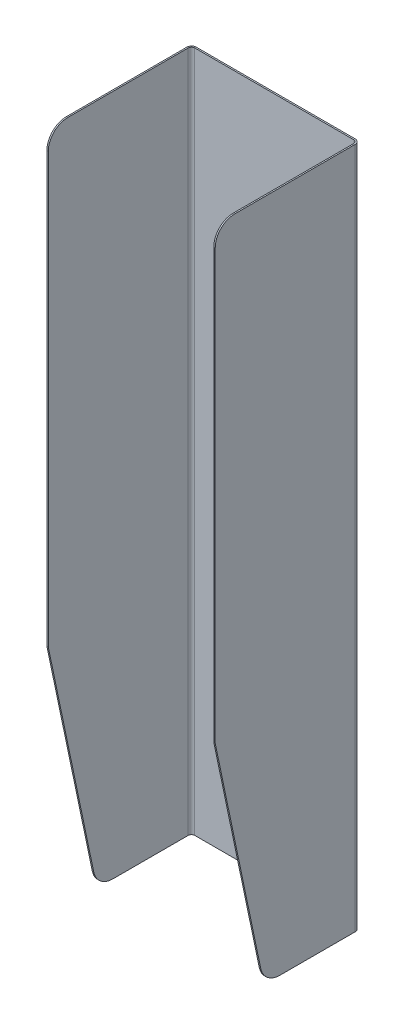
ISO-10303-21;
HEADER;
FILE_DESCRIPTION(('STEP AP214'),'2;1');
FILE_NAME('part.step','',(''),(''),'','','');
FILE_SCHEMA(('AUTOMOTIVE_DESIGN { 1 0 10303 214 1 1 1 1 }'));
ENDSEC;
DATA;
#1=APPLICATION_CONTEXT('core data for automotive mechanical design processes');
#2=APPLICATION_PROTOCOL_DEFINITION('international standard','automotive_design',2000,#1);
#3=PRODUCT_CONTEXT('',#1,'mechanical');
#4=PRODUCT('Part','Part','',(#3));
#5=PRODUCT_RELATED_PRODUCT_CATEGORY('part','',(#4));
#6=PRODUCT_DEFINITION_FORMATION('','',#4);
#7=PRODUCT_DEFINITION_CONTEXT('part definition',#1,'design');
#8=PRODUCT_DEFINITION('design','',#6,#7);
#9=PRODUCT_DEFINITION_SHAPE('','',#8);
#10=(LENGTH_UNIT() NAMED_UNIT(*) SI_UNIT(.MILLI.,.METRE.));
#11=(NAMED_UNIT(*) PLANE_ANGLE_UNIT() SI_UNIT($,.RADIAN.));
#12=(NAMED_UNIT(*) SI_UNIT($,.STERADIAN.) SOLID_ANGLE_UNIT());
#13=UNCERTAINTY_MEASURE_WITH_UNIT(LENGTH_MEASURE(1.E-05),#10,'distance_accuracy_value','');
#14=(GEOMETRIC_REPRESENTATION_CONTEXT(3) GLOBAL_UNCERTAINTY_ASSIGNED_CONTEXT((#13)) GLOBAL_UNIT_ASSIGNED_CONTEXT((#10,
#11,#12)) REPRESENTATION_CONTEXT('',''));
#15=CARTESIAN_POINT('',(0.,0.,0.));
#16=DIRECTION('',(0.,0.,1.));
#17=DIRECTION('',(1.,0.,0.));
#18=AXIS2_PLACEMENT_3D('',#15,#16,#17);
#19=CARTESIAN_POINT('',(5710.61630451223,-816.447312940981,3424.54131291176));
#20=DIRECTION('',(0.,-0.204525333933384,0.978861270956941));
#21=DIRECTION('',(0.,-0.978861270956941,-0.204525333933384));
#22=AXIS2_PLACEMENT_3D('',#19,#20,#21);
#23=PLANE('',#22);
#24=DIRECTION('',(1.,0.,0.));
#25=VECTOR('',#24,1.);
#26=CARTESIAN_POINT('',(6243.83674885551,-564.899532154496,3477.10023560305));
#27=LINE('',#26,#25);
#28=CARTESIAN_POINT('',(6243.12024088786,-564.899532154487,3477.10023560292));
#29=VERTEX_POINT('',#28);
#30=CARTESIAN_POINT('',(6244.55325682317,-564.899532155283,3477.10023560276));
#31=VERTEX_POINT('',#30);
#32=EDGE_CURVE('E246',#29,#31,#27,.T.);
#33=ORIENTED_EDGE('',*,*,#32,.F.);
#34=DIRECTION('',(0.,0.978861270956941,0.204525333933385));
#35=VECTOR('',#34,1.);
#36=CARTESIAN_POINT('',(6243.12024088786,-788.3203147037,3430.41822711575));
#37=LINE('',#36,#35);
#38=CARTESIAN_POINT('',(6243.12024088786,-788.320314703688,3430.41822711575));
#39=VERTEX_POINT('',#38);
#40=EDGE_CURVE('E213',#39,#29,#37,.T.);
#41=ORIENTED_EDGE('',*,*,#40,.F.);
#42=DIRECTION('',(-1.,0.,0.));
#43=VECTOR('',#42,1.);
#44=CARTESIAN_POINT('',(6243.83674885551,-788.3203147037,3430.41822711575));
#45=LINE('',#44,#43);
#46=CARTESIAN_POINT('',(6244.55325682317,-788.320314703688,3430.41822711575));
#47=VERTEX_POINT('',#46);
#48=EDGE_CURVE('E241',#47,#39,#45,.T.);
#49=ORIENTED_EDGE('',*,*,#48,.F.);
#50=DIRECTION('',(0.,-0.978861270956938,-0.204525333933397));
#51=VECTOR('',#50,1.);
#52=CARTESIAN_POINT('',(6244.55325682317,-564.899532154508,3477.10023560288));
#53=LINE('',#52,#51);
#54=EDGE_CURVE('E230',#31,#47,#53,.T.);
#55=ORIENTED_EDGE('',*,*,#54,.F.);
#56=EDGE_LOOP('',(#33,#41,#49,#55));
#57=FACE_BOUND('',#56,.T.);
#58=ADVANCED_FACE('F17',(#57),#23,.T.);
#59=CARTESIAN_POINT('',(6243.12024088786,-804.229808025032,3477.10023560305));
#60=DIRECTION('',(0.,0.,1.));
#61=DIRECTION('',(1.,0.,0.));
#62=AXIS2_PLACEMENT_3D('',#59,#60,#61);
#63=PLANE('',#62);
#64=DIRECTION('',(1.,1.65841347602452E-12,-1.18150694116774E-11));
#65=VECTOR('',#64,1.);
#66=CARTESIAN_POINT('',(6236.09080639473,-124.229808025051,3477.10023560189));
#67=LINE('',#66,#65);
#68=CARTESIAN_POINT('',(6243.12024088813,-124.229808020915,3477.10023560234));
#69=VERTEX_POINT('',#68);
#70=CARTESIAN_POINT('',(6244.55325682317,-124.229808020912,3477.10023560217));
#71=VERTEX_POINT('',#70);
#72=EDGE_CURVE('E152',#69,#71,#67,.T.);
#73=ORIENTED_EDGE('',*,*,#72,.F.);
#74=DIRECTION('',(0.,1.,0.));
#75=VECTOR('',#74,1.);
#76=CARTESIAN_POINT('',(6243.12024088786,-454.229808025032,3477.10023560288));
#77=LINE('',#76,#75);
#78=EDGE_CURVE('E210',#29,#69,#77,.T.);
#79=ORIENTED_EDGE('',*,*,#78,.F.);
#80=ORIENTED_EDGE('',*,*,#32,.T.);
#81=DIRECTION('',(0.,-1.,0.));
#82=VECTOR('',#81,1.);
#83=CARTESIAN_POINT('',(6244.55325682317,-454.229808025032,3477.10023560255));
#84=LINE('',#83,#82);
#85=EDGE_CURVE('E160',#71,#31,#84,.T.);
#86=ORIENTED_EDGE('',*,*,#85,.F.);
#87=EDGE_LOOP('',(#73,#79,#80,#86));
#88=FACE_BOUND('',#87,.T.);
#89=ADVANCED_FACE('F375',(#88),#63,.T.);
#90=CARTESIAN_POINT('',(6099.82030520555,-124.229808017028,3457.10023561151));
#91=DIRECTION('',(1.,1.65841347602452E-12,-1.18150694116774E-11));
#92=DIRECTION('',(-1.18150694116774E-11,0.,-1.));
#93=AXIS2_PLACEMENT_3D('',#90,#91,#92);
#94=CYLINDRICAL_SURFACE('',#93,19.9999999918697);
#95=DIRECTION('',(-1.,0.,2.79595608917691E-11));
#96=VECTOR('',#95,1.);
#97=CARTESIAN_POINT('',(6236.09080639237,-104.229808025032,3457.1002356079));
#98=LINE('',#97,#96);
#99=CARTESIAN_POINT('',(6244.55325682284,-104.229808025032,3457.10023560873));
#100=VERTEX_POINT('',#99);
#101=CARTESIAN_POINT('',(6243.12024088786,-104.229808025032,3457.10023560876));
#102=VERTEX_POINT('',#101);
#103=EDGE_CURVE('E139',#100,#102,#98,.T.);
#104=ORIENTED_EDGE('',*,*,#103,.T.);
#105=CARTESIAN_POINT('',(6243.12024088789,-124.22980801679,3457.10023560982));
#106=DIRECTION('',(1.,1.65841347602452E-12,-1.18150694116774E-11));
#107=DIRECTION('',(-1.18150694116774E-11,0.,-1.));
#108=AXIS2_PLACEMENT_3D('',#105,#106,#107);
#109=CIRCLE('',#108,19.9999999918697);
#110=EDGE_CURVE('E212',#69,#102,#109,.F.);
#111=ORIENTED_EDGE('',*,*,#110,.F.);
#112=ORIENTED_EDGE('',*,*,#72,.T.);
#113=CARTESIAN_POINT('',(6244.55325682293,-124.229808016788,3457.1002356098));
#114=DIRECTION('',(1.,1.65841347602452E-12,-1.18150694116774E-11));
#115=DIRECTION('',(-1.18150694116774E-11,0.,-1.));
#116=AXIS2_PLACEMENT_3D('',#113,#114,#115);
#117=CIRCLE('',#116,19.9999999918697);
#118=EDGE_CURVE('E21',#100,#71,#117,.T.);
#119=ORIENTED_EDGE('',*,*,#118,.F.);
#120=EDGE_LOOP('',(#104,#111,#112,#119));
#121=FACE_BOUND('',#120,.T.);
#122=ADVANCED_FACE('F156',(#121),#94,.T.);
#123=CARTESIAN_POINT('',(5855.82311737198,-784.229808025028,3410.84100169661));
#124=DIRECTION('',(1.,0.,0.));
#125=DIRECTION('',(0.,1.,0.));
#126=AXIS2_PLACEMENT_3D('',#123,#124,#125);
#127=CYLINDRICAL_SURFACE('',#126,20.0000000000027);
#128=ORIENTED_EDGE('',*,*,#48,.T.);
#129=CARTESIAN_POINT('',(6243.12024088786,-784.229808025002,3410.84100169659));
#130=DIRECTION('',(1.,0.,0.));
#131=DIRECTION('',(0.,1.,0.));
#132=AXIS2_PLACEMENT_3D('',#129,#130,#131);
#133=CIRCLE('',#132,20.0000000000027);
#134=CARTESIAN_POINT('',(6243.12024088786,-804.229808025032,3410.8410016966));
#135=VERTEX_POINT('',#134);
#136=EDGE_CURVE('E328',#135,#39,#133,.F.);
#137=ORIENTED_EDGE('',*,*,#136,.F.);
#138=DIRECTION('',(1.,0.,0.));
#139=VECTOR('',#138,1.);
#140=CARTESIAN_POINT('',(6243.83674885551,-804.229808025032,3410.84100169661));
#141=LINE('',#140,#139);
#142=CARTESIAN_POINT('',(6244.55325682317,-804.229808025032,3410.8410016966));
#143=VERTEX_POINT('',#142);
#144=EDGE_CURVE('E151',#135,#143,#141,.T.);
#145=ORIENTED_EDGE('',*,*,#144,.T.);
#146=CARTESIAN_POINT('',(6244.55325682317,-784.229808025002,3410.84100169659));
#147=DIRECTION('',(1.,0.,0.));
#148=DIRECTION('',(0.,1.,0.));
#149=AXIS2_PLACEMENT_3D('',#146,#147,#148);
#150=CIRCLE('',#149,20.0000000000027);
#151=EDGE_CURVE('E228',#47,#143,#150,.T.);
#152=ORIENTED_EDGE('',*,*,#151,.F.);
#153=EDGE_LOOP('',(#128,#137,#145,#152));
#154=FACE_BOUND('',#153,.T.);
#155=ADVANCED_FACE('F347',(#154),#127,.T.);
#156=CARTESIAN_POINT('',(6271.20901105684,-124.229808017864,3457.10023561167));
#157=DIRECTION('',(1.,0.,-2.93728386884162E-11));
#158=DIRECTION('',(-2.93728386884162E-11,0.,-1.));
#159=AXIS2_PLACEMENT_3D('',#156,#157,#158);
#160=CYLINDRICAL_SURFACE('',#159,19.9999999927421);
#161=DIRECTION('',(-1.,0.,2.3156299631593E-11));
#162=VECTOR('',#161,1.);
#163=CARTESIAN_POINT('',(6415.22545472493,-104.229808025032,3457.10023560811));
#164=LINE('',#163,#162);
#165=CARTESIAN_POINT('',(6415.94196268623,-104.229808025032,3457.10023560776));
#166=VERTEX_POINT('',#165);
#167=CARTESIAN_POINT('',(6414.50894675156,-104.229808025032,3457.1002356078));
#168=VERTEX_POINT('',#167);
#169=EDGE_CURVE('E239',#166,#168,#164,.T.);
#170=ORIENTED_EDGE('',*,*,#169,.T.);
#171=CARTESIAN_POINT('',(6414.50894675156,-124.22980801785,3457.10023560746));
#172=DIRECTION('',(1.,0.,-2.93728386884162E-11));
#173=DIRECTION('',(-2.93728386884162E-11,0.,-1.));
#174=AXIS2_PLACEMENT_3D('',#171,#172,#173);
#175=CIRCLE('',#174,19.9999999927421);
#176=CARTESIAN_POINT('',(6414.50894675186,-124.229808021379,3477.10023560276));
#177=VERTEX_POINT('',#176);
#178=EDGE_CURVE('E218',#177,#168,#175,.F.);
#179=ORIENTED_EDGE('',*,*,#178,.F.);
#180=DIRECTION('',(-1.,0.,0.));
#181=VECTOR('',#180,1.);
#182=CARTESIAN_POINT('',(6415.22545471922,-124.229808024907,3477.10023560305));
#183=LINE('',#182,#181);
#184=CARTESIAN_POINT('',(6415.94196268687,-124.229808021379,3477.10023560249));
#185=VERTEX_POINT('',#184);
#186=EDGE_CURVE('E237',#185,#177,#183,.T.);
#187=ORIENTED_EDGE('',*,*,#186,.F.);
#188=CARTESIAN_POINT('',(6415.94196268628,-124.22980801785,3457.10023560742));
#189=DIRECTION('',(1.,0.,-2.93728386884162E-11));
#190=DIRECTION('',(-2.93728386884162E-11,0.,-1.));
#191=AXIS2_PLACEMENT_3D('',#188,#189,#190);
#192=CIRCLE('',#191,19.9999999927421);
#193=EDGE_CURVE('E207',#166,#185,#192,.T.);
#194=ORIENTED_EDGE('',*,*,#193,.F.);
#195=EDGE_LOOP('',(#170,#179,#187,#194));
#196=FACE_BOUND('',#195,.T.);
#197=ADVANCED_FACE('F409',(#196),#160,.T.);
#198=CARTESIAN_POINT('',(6414.50894675156,-804.229808025032,3477.10023560305));
#199=DIRECTION('',(0.,0.,1.));
#200=DIRECTION('',(1.,0.,0.));
#201=AXIS2_PLACEMENT_3D('',#198,#199,#200);
#202=PLANE('',#201);
#203=ORIENTED_EDGE('',*,*,#186,.T.);
#204=DIRECTION('',(0.,1.,0.));
#205=VECTOR('',#204,1.);
#206=CARTESIAN_POINT('',(6414.50894675156,-454.229808025032,3477.10023560267));
#207=LINE('',#206,#205);
#208=CARTESIAN_POINT('',(6414.50894675156,-564.899532155527,3477.10023560267));
#209=VERTEX_POINT('',#208);
#210=EDGE_CURVE('E215',#209,#177,#207,.T.);
#211=ORIENTED_EDGE('',*,*,#210,.F.);
#212=DIRECTION('',(1.,0.,0.));
#213=VECTOR('',#212,1.);
#214=CARTESIAN_POINT('',(5710.61630451223,-564.89953215554,3477.10023560266));
#215=LINE('',#214,#213);
#216=CARTESIAN_POINT('',(6415.94196268687,-564.899532157289,3477.1002356023));
#217=VERTEX_POINT('',#216);
#218=EDGE_CURVE('E233',#217,#209,#215,.F.);
#219=ORIENTED_EDGE('',*,*,#218,.F.);
#220=DIRECTION('',(0.,-1.,0.));
#221=VECTOR('',#220,1.);
#222=CARTESIAN_POINT('',(6415.94196268687,-454.229808025032,3477.10023560193));
#223=LINE('',#222,#221);
#224=EDGE_CURVE('E203',#185,#217,#223,.T.);
#225=ORIENTED_EDGE('',*,*,#224,.F.);
#226=EDGE_LOOP('',(#203,#211,#219,#225));
#227=FACE_BOUND('',#226,.T.);
#228=ADVANCED_FACE('F406',(#227),#202,.T.);
#229=CARTESIAN_POINT('',(5710.61630451223,-816.447312940981,3424.54131291176));
#230=DIRECTION('',(0.,-0.204525333933384,0.978861270956941));
#231=DIRECTION('',(0.,-0.978861270956941,-0.204525333933384));
#232=AXIS2_PLACEMENT_3D('',#229,#230,#231);
#233=PLANE('',#232);
#234=ORIENTED_EDGE('',*,*,#218,.T.);
#235=DIRECTION('',(0.,0.978861270956938,0.204525333933397));
#236=VECTOR('',#235,1.);
#237=CARTESIAN_POINT('',(6414.50894675156,-788.3203147037,3430.41822711575));
#238=LINE('',#237,#236);
#239=CARTESIAN_POINT('',(6414.50894675156,-788.320314703688,3430.41822711575));
#240=VERTEX_POINT('',#239);
#241=EDGE_CURVE('E219',#240,#209,#238,.T.);
#242=ORIENTED_EDGE('',*,*,#241,.F.);
#243=DIRECTION('',(-1.,0.,0.));
#244=VECTOR('',#243,1.);
#245=CARTESIAN_POINT('',(6415.22545471922,-788.3203147037,3430.41822711575));
#246=LINE('',#245,#244);
#247=CARTESIAN_POINT('',(6415.94196268687,-788.320314703688,3430.41822711575));
#248=VERTEX_POINT('',#247);
#249=EDGE_CURVE('E161',#248,#240,#246,.T.);
#250=ORIENTED_EDGE('',*,*,#249,.F.);
#251=DIRECTION('',(0.,-0.978861270956942,-0.204525333933378));
#252=VECTOR('',#251,1.);
#253=CARTESIAN_POINT('',(6415.94196268687,-564.89953215554,3477.10023560266));
#254=LINE('',#253,#252);
#255=EDGE_CURVE('E206',#217,#248,#254,.T.);
#256=ORIENTED_EDGE('',*,*,#255,.F.);
#257=EDGE_LOOP('',(#234,#242,#250,#256));
#258=FACE_BOUND('',#257,.T.);
#259=ADVANCED_FACE('F402',(#258),#233,.T.);
#260=CARTESIAN_POINT('',(6027.21182323569,-784.229808025028,3410.84100169661));
#261=DIRECTION('',(1.,0.,0.));
#262=DIRECTION('',(0.,1.,0.));
#263=AXIS2_PLACEMENT_3D('',#260,#261,#262);
#264=CYLINDRICAL_SURFACE('',#263,20.0000000000027);
#265=ORIENTED_EDGE('',*,*,#249,.T.);
#266=CARTESIAN_POINT('',(6414.50894675156,-784.229808025002,3410.84100169659));
#267=DIRECTION('',(1.,0.,0.));
#268=DIRECTION('',(0.,1.,0.));
#269=AXIS2_PLACEMENT_3D('',#266,#267,#268);
#270=CIRCLE('',#269,20.0000000000027);
#271=CARTESIAN_POINT('',(6414.50894675156,-804.229808025032,3410.8410016966));
#272=VERTEX_POINT('',#271);
#273=EDGE_CURVE('E222',#272,#240,#270,.F.);
#274=ORIENTED_EDGE('',*,*,#273,.F.);
#275=DIRECTION('',(1.,0.,0.));
#276=VECTOR('',#275,1.);
#277=CARTESIAN_POINT('',(6415.22545471922,-804.229808025032,3410.84100169661));
#278=LINE('',#277,#276);
#279=CARTESIAN_POINT('',(6415.94196268687,-804.229808025032,3410.8410016966));
#280=VERTEX_POINT('',#279);
#281=EDGE_CURVE('E231',#272,#280,#278,.T.);
#282=ORIENTED_EDGE('',*,*,#281,.T.);
#283=CARTESIAN_POINT('',(6415.94196268687,-784.229808025002,3410.84100169659));
#284=DIRECTION('',(1.,0.,0.));
#285=DIRECTION('',(0.,1.,0.));
#286=AXIS2_PLACEMENT_3D('',#283,#284,#285);
#287=CIRCLE('',#286,20.0000000000027);
#288=EDGE_CURVE('E202',#248,#280,#287,.T.);
#289=ORIENTED_EDGE('',*,*,#288,.F.);
#290=EDGE_LOOP('',(#265,#274,#282,#289));
#291=FACE_BOUND('',#290,.T.);
#292=ADVANCED_FACE('F399',(#291),#264,.T.);
#293=CARTESIAN_POINT('',(6244.55325682317,-804.229808025032,3477.24373560305));
#294=DIRECTION('',(1.,0.,0.));
#295=DIRECTION('',(0.,0.,-1.));
#296=AXIS2_PLACEMENT_3D('',#293,#294,#295);
#297=PLANE('',#296);
#298=ORIENTED_EDGE('',*,*,#54,.T.);
#299=ORIENTED_EDGE('',*,*,#151,.T.);
#300=DIRECTION('',(0.,0.,-1.));
#301=VECTOR('',#300,1.);
#302=CARTESIAN_POINT('',(6244.55325682317,-804.229808025032,3310.03773560305));
#303=LINE('',#302,#301);
#304=CARTESIAN_POINT('',(6244.55325682317,-804.229808025032,3333.60023560305));
#305=VERTEX_POINT('',#304);
#306=EDGE_CURVE('E186',#305,#143,#303,.F.);
#307=ORIENTED_EDGE('',*,*,#306,.F.);
#308=DIRECTION('',(0.,-1.,0.));
#309=VECTOR('',#308,1.);
#310=CARTESIAN_POINT('',(6244.55325682317,-454.229808025032,3333.60023560305));
#311=LINE('',#310,#309);
#312=CARTESIAN_POINT('',(6244.55325682307,-104.229808025032,3333.60023560305));
#313=VERTEX_POINT('',#312);
#314=EDGE_CURVE('E165',#313,#305,#311,.T.);
#315=ORIENTED_EDGE('',*,*,#314,.F.);
#316=DIRECTION('',(0.,0.,1.));
#317=VECTOR('',#316,1.);
#318=CARTESIAN_POINT('',(6244.55325682277,-104.229808025032,3310.03773560305));
#319=LINE('',#318,#317);
#320=EDGE_CURVE('E145',#100,#313,#319,.F.);
#321=ORIENTED_EDGE('',*,*,#320,.F.);
#322=ORIENTED_EDGE('',*,*,#118,.T.);
#323=ORIENTED_EDGE('',*,*,#85,.T.);
#324=EDGE_LOOP('',(#298,#299,#307,#315,#321,#322,#323));
#325=FACE_BOUND('',#324,.T.);
#326=ADVANCED_FACE('F163',(#325),#297,.T.);
#327=CARTESIAN_POINT('',(6244.55325682317,-804.229808025032,3333.60023560305));
#328=CARTESIAN_POINT('',(6244.55325682317,-104.229808025032,3333.60023560305));
#329=CARTESIAN_POINT('',(6244.55325682317,-804.229808025032,3330.10023560305));
#330=CARTESIAN_POINT('',(6244.55325682317,-104.229808025032,3330.10023560305));
#331=CARTESIAN_POINT('',(6247.89696067224,-804.229808025032,3330.10023560305));
#332=CARTESIAN_POINT('',(6247.89696067224,-104.229808025032,3330.10023560305));
#333=(BOUNDED_SURFACE() B_SPLINE_SURFACE(2,1,((#327,#328),(#329,#330),(#331,#332)),
.UNSPECIFIED.,.F.,.F.,.F.) B_SPLINE_SURFACE_WITH_KNOTS((3,3),(2,2),(622.071814493869,
629.877862906506),(0.,700.),
.UNSPECIFIED.) GEOMETRIC_REPRESENTATION_ITEM() RATIONAL_B_SPLINE_SURFACE(((1.,1.),
(0.707106781185812,0.707106781185812),(1.,1.))) REPRESENTATION_ITEM('') SURFACE());
#334=CARTESIAN_POINT('',(6244.55325682317,-104.229808025032,3333.60023560305));
#335=CARTESIAN_POINT('',(6244.55325033344,-104.229808025032,3333.498273813));
#336=CARTESIAN_POINT('',(6244.55751350092,-104.229808025032,3333.39631507893));
#337=CARTESIAN_POINT('',(6244.57452822644,-104.229808025032,3333.19310385464));
#338=CARTESIAN_POINT('',(6244.58728016508,-104.229808025032,3333.0918513963));
#339=CARTESIAN_POINT('',(6244.62123229109,-104.229808025032,3332.89069819503));
#340=CARTESIAN_POINT('',(6244.64243784502,-104.229808025032,3332.79079835252));
#341=CARTESIAN_POINT('',(6244.69316746271,-104.229808025032,3332.59316562431));
#342=CARTESIAN_POINT('',(6244.7226912768,-104.229808025032,3332.49543267367));
#343=CARTESIAN_POINT('',(6244.82361523519,-104.229808025032,3332.20635271503));
#344=CARTESIAN_POINT('',(6244.90736541514,-104.229808025032,3332.01913931161));
#345=CARTESIAN_POINT('',(6245.10574970815,-104.229808025032,3331.66207822541));
#346=CARTESIAN_POINT('',(6245.22036606828,-104.229808025032,3331.49222063751));
#347=CARTESIAN_POINT('',(6245.47472792363,-104.229808025032,3331.1789343234));
#348=CARTESIAN_POINT('',(6245.61382806362,-104.229808025032,3331.03498346482));
#349=CARTESIAN_POINT('',(6245.91521549723,-104.229808025032,3330.77376946968));
#350=CARTESIAN_POINT('',(6246.07750430018,-104.229808025032,3330.6565080716));
#351=CARTESIAN_POINT('',(6246.41312903326,-104.229808025032,3330.45754930641));
#352=CARTESIAN_POINT('',(6246.58566718463,-104.229808025032,3330.37451662047));
#353=CARTESIAN_POINT('',(6246.85309279605,-104.229808025032,3330.27368050835));
#354=CARTESIAN_POINT('',(6246.9436659454,-104.229808025032,3330.24402158429));
#355=CARTESIAN_POINT('',(6247.12707096168,-104.229808025032,3330.19282995535));
#356=CARTESIAN_POINT('',(6247.21990196585,-104.229808025032,3330.17129419683));
#357=CARTESIAN_POINT('',(6247.40972887243,-104.229808025032,3330.13608298919));
#358=CARTESIAN_POINT('',(6247.50676863254,-104.229808025032,3330.12264433662));
#359=CARTESIAN_POINT('',(6247.70152471279,-104.229808025032,3330.10471937184));
#360=CARTESIAN_POINT('',(6247.79923980763,-104.229808025032,3330.10021973389));
#361=CARTESIAN_POINT('',(6247.89696067224,-104.229808025032,3330.10023560305));
#362=B_SPLINE_CURVE_WITH_KNOTS('',3,(#334,#335,#336,#337,#338,#339,#340,#341,#342,#343,#344,
#345,#346,#347,#348,#349,#350,#351,#352,#353,#354,#355,#356,#357,#358,#359,#360,#361),
.UNSPECIFIED.,.F.,.F.,(4,2,2,2,2,2,2,2,2,2,2,2,2,4),(0.,0.30579035948938,0.611594429708169,
0.917592941690297,1.22358227031815,1.83560511797808,2.44727670462998,3.04474408803706,
3.64225037809817,4.21352507286864,4.49913160700031,4.78463066938612,5.07811815852732,
5.37116780490268),.UNSPECIFIED.);
#363=CARTESIAN_POINT('',(6247.89696067224,-104.229808025032,3330.10023560305));
#364=VERTEX_POINT('',#363);
#365=EDGE_CURVE('E167',#313,#364,#362,.T.);
#366=CARTESIAN_POINT('',(6247.89696067224,-804.229808025032,3330.10023560305));
#367=CARTESIAN_POINT('',(6247.80604736971,-804.229808025032,3330.10022401638));
#368=CARTESIAN_POINT('',(6247.71513963073,-804.229808025032,3330.10411656748));
#369=CARTESIAN_POINT('',(6247.53399695496,-804.229808025032,3330.11962079665));
#370=CARTESIAN_POINT('',(6247.44376192722,-804.229808025032,3330.13123141142));
#371=CARTESIAN_POINT('',(6247.26477764718,-804.229808025032,3330.16205223728));
#372=CARTESIAN_POINT('',(6247.17602581524,-804.229808025032,3330.18124741275));
#373=CARTESIAN_POINT('',(6247.00047966416,-804.229808025032,3330.22704555163));
#374=CARTESIAN_POINT('',(6246.91368535528,-804.229808025032,3330.2536485538));
#375=CARTESIAN_POINT('',(6246.65714147837,-804.229808025032,3330.3442585045));
#376=CARTESIAN_POINT('',(6246.49107674628,-804.229808025032,3330.41909325132));
#377=CARTESIAN_POINT('',(6246.17361058627,-804.229808025032,3330.59501664111));
#378=CARTESIAN_POINT('',(6246.02221179295,-804.229808025032,3330.69610998921));
#379=CARTESIAN_POINT('',(6245.73484062533,-804.229808025032,3330.92362604063));
#380=CARTESIAN_POINT('',(6245.5992366771,-804.229808025032,3331.05051423772));
#381=CARTESIAN_POINT('',(6245.35019815926,-804.229808025032,3331.32443890227));
#382=CARTESIAN_POINT('',(6245.23676909768,-804.229808025032,3331.47148036025));
#383=CARTESIAN_POINT('',(6245.03019682191,-804.229808025032,3331.78813839058));
#384=CARTESIAN_POINT('',(6244.93811528631,-804.229808025032,3331.958447004));
#385=CARTESIAN_POINT('',(6244.78256626437,-804.229808025032,3332.31166976171));
#386=CARTESIAN_POINT('',(6244.71909984872,-804.229808025032,3332.49458437741));
#387=CARTESIAN_POINT('',(6244.63157571091,-804.229808025032,3332.83127331161));
#388=CARTESIAN_POINT('',(6244.60222022075,-804.229808025032,3332.98369749982));
#389=CARTESIAN_POINT('',(6244.5630594439,-804.229808025032,3333.29081622635));
#390=CARTESIAN_POINT('',(6244.55322627341,-804.229808025032,3333.44550720819));
#391=CARTESIAN_POINT('',(6244.55325682317,-804.229808025032,3333.60023560305));
#392=B_SPLINE_CURVE_WITH_KNOTS('',3,(#366,#367,#368,#369,#370,#371,#372,#373,#374,#375,#376,
#377,#378,#379,#380,#381,#382,#383,#384,#385,#386,#387,#388,#389,#390,#391),.UNSPECIFIED.,.F.,
.F.,(4,2,2,2,2,2,2,2,2,2,2,2,4),(0.,0.272646928710495,0.545256303207404,0.81732794676859,
1.08940101350812,1.63308345437962,2.17686338193446,2.73150215174542,3.28627851430431,
3.86453360787098,4.44281033632551,4.90727392235116,5.37107363502792),.UNSPECIFIED.);
#393=CARTESIAN_POINT('',(6247.89696067224,-804.229808025032,3330.10023560305));
#394=VERTEX_POINT('',#393);
#395=EDGE_CURVE('E189',#394,#305,#392,.T.);
#396=DIRECTION('',(0.,-1.,0.));
#397=VECTOR('',#396,1.);
#398=CARTESIAN_POINT('',(6247.89696067224,-454.229808025032,3330.10023560305));
#399=LINE('',#398,#397);
#400=EDGE_CURVE('E225',#364,#394,#399,.T.);
#401=ORIENTED_EDGE('',*,*,#365,.F.);
#402=ORIENTED_EDGE('',*,*,#314,.T.);
#403=ORIENTED_EDGE('',*,*,#395,.F.);
#404=ORIENTED_EDGE('',*,*,#400,.F.);
#405=EDGE_LOOP('',(#401,#402,#403,#404));
#406=FACE_BOUND('',#405,.T.);
#407=ADVANCED_FACE('F301',(#406),#333,.T.);
#408=CARTESIAN_POINT('',(6247.89696067224,-804.229808025032,3330.10023560305));
#409=DIRECTION('',(0.,0.,1.));
#410=DIRECTION('',(1.,0.,0.));
#411=AXIS2_PLACEMENT_3D('',#408,#409,#410);
#412=PLANE('',#411);
#413=DIRECTION('',(1.,0.,0.));
#414=VECTOR('',#413,1.);
#415=CARTESIAN_POINT('',(6437.54467791175,-104.229808025032,3330.10023560305));
#416=LINE('',#415,#414);
#417=CARTESIAN_POINT('',(6411.16524290249,-104.229808025032,3330.10023560305));
#418=VERTEX_POINT('',#417);
#419=EDGE_CURVE('E170',#364,#418,#416,.T.);
#420=ORIENTED_EDGE('',*,*,#419,.F.);
#421=ORIENTED_EDGE('',*,*,#400,.T.);
#422=DIRECTION('',(1.,0.,0.));
#423=VECTOR('',#422,1.);
#424=CARTESIAN_POINT('',(6437.54467791175,-804.229808025032,3330.10023560305));
#425=LINE('',#424,#423);
#426=CARTESIAN_POINT('',(6411.16524290249,-804.229808025032,3330.10023560305));
#427=VERTEX_POINT('',#426);
#428=EDGE_CURVE('E190',#427,#394,#425,.F.);
#429=ORIENTED_EDGE('',*,*,#428,.F.);
#430=DIRECTION('',(0.,-1.,0.));
#431=VECTOR('',#430,1.);
#432=CARTESIAN_POINT('',(6411.16524290249,-454.229808025032,3330.10023560305));
#433=LINE('',#432,#431);
#434=EDGE_CURVE('E223',#418,#427,#433,.T.);
#435=ORIENTED_EDGE('',*,*,#434,.F.);
#436=EDGE_LOOP('',(#420,#421,#429,#435));
#437=FACE_BOUND('',#436,.T.);
#438=ADVANCED_FACE('F297',(#437),#412,.T.);
#439=CARTESIAN_POINT('',(6411.16524290249,-804.229808025032,3330.10023560305));
#440=CARTESIAN_POINT('',(6411.16524290249,-104.229808025032,3330.10023560305));
#441=CARTESIAN_POINT('',(6414.50894675156,-804.229808025032,3330.10023560305));
#442=CARTESIAN_POINT('',(6414.50894675156,-104.229808025032,3330.10023560305));
#443=CARTESIAN_POINT('',(6414.50894675156,-804.229808025032,3333.60023560305));
#444=CARTESIAN_POINT('',(6414.50894675156,-104.229808025032,3333.60023560305));
#445=(BOUNDED_SURFACE() B_SPLINE_SURFACE(2,1,((#439,#440),(#441,#442),(#443,#444)),
.UNSPECIFIED.,.F.,.F.,.F.) B_SPLINE_SURFACE_WITH_KNOTS((3,3),(2,2),(-151.870909739568,
-144.064861326932),(0.,700.),
.UNSPECIFIED.) GEOMETRIC_REPRESENTATION_ITEM() RATIONAL_B_SPLINE_SURFACE(((1.,1.),
(0.707106781186548,0.707106781186548),(1.,1.))) REPRESENTATION_ITEM('') SURFACE());
#446=CARTESIAN_POINT('',(6411.16524290249,-104.229808025032,3330.10023560305));
#447=CARTESIAN_POINT('',(6411.25615620502,-104.229808025032,3330.10022401638));
#448=CARTESIAN_POINT('',(6411.347063944,-104.229808025032,3330.10411656748));
#449=CARTESIAN_POINT('',(6411.52820661977,-104.229808025032,3330.11962079665));
#450=CARTESIAN_POINT('',(6411.61844164751,-104.229808025032,3330.13123141142));
#451=CARTESIAN_POINT('',(6411.79742592755,-104.229808025032,3330.16205223728));
#452=CARTESIAN_POINT('',(6411.8861777595,-104.229808025032,3330.18124741275));
#453=CARTESIAN_POINT('',(6412.06172391057,-104.229808025032,3330.22704555163));
#454=CARTESIAN_POINT('',(6412.14851821945,-104.229808025032,3330.2536485538));
#455=CARTESIAN_POINT('',(6412.40506209636,-104.229808025032,3330.3442585045));
#456=CARTESIAN_POINT('',(6412.57112682845,-104.229808025032,3330.41909325132));
#457=CARTESIAN_POINT('',(6412.88859298846,-104.229808025032,3330.59501664111));
#458=CARTESIAN_POINT('',(6413.03999178179,-104.229808025032,3330.69610998921));
#459=CARTESIAN_POINT('',(6413.32736294941,-104.229808025032,3330.92362604063));
#460=CARTESIAN_POINT('',(6413.46296689763,-104.229808025032,3331.05051423772));
#461=CARTESIAN_POINT('',(6413.71200541547,-104.229808025032,3331.32443890228));
#462=CARTESIAN_POINT('',(6413.82543447705,-104.229808025032,3331.47148036025));
#463=CARTESIAN_POINT('',(6414.03200675282,-104.229808025032,3331.78813839059));
#464=CARTESIAN_POINT('',(6414.12408828842,-104.229808025032,3331.958447004));
#465=CARTESIAN_POINT('',(6414.27963731037,-104.229808025032,3332.31166976172));
#466=CARTESIAN_POINT('',(6414.34310372602,-104.229808025032,3332.49458437741));
#467=CARTESIAN_POINT('',(6414.43062786382,-104.229808025032,3332.83127331161));
#468=CARTESIAN_POINT('',(6414.45998335398,-104.229808025032,3332.98369749982));
#469=CARTESIAN_POINT('',(6414.49914413083,-104.229808025032,3333.29081622635));
#470=CARTESIAN_POINT('',(6414.50897730132,-104.229808025032,3333.44550720819));
#471=CARTESIAN_POINT('',(6414.50894675156,-104.229808025032,3333.60023560305));
#472=B_SPLINE_CURVE_WITH_KNOTS('',3,(#446,#447,#448,#449,#450,#451,#452,#453,#454,#455,#456,
#457,#458,#459,#460,#461,#462,#463,#464,#465,#466,#467,#468,#469,#470,#471),.UNSPECIFIED.,.F.,
.F.,(4,2,2,2,2,2,2,2,2,2,2,2,4),(0.,0.272646928711363,0.545256303208272,0.817327946771288,
1.08940101351082,1.63308345438242,2.17686338193726,2.73150215174853,3.28627851430579,
3.86453360787291,4.44281033632744,4.90727392235205,5.37107363502831),.UNSPECIFIED.);
#473=CARTESIAN_POINT('',(6414.50894675156,-104.229808025032,3333.60023560305));
#474=VERTEX_POINT('',#473);
#475=EDGE_CURVE('E279',#418,#474,#472,.T.);
#476=CARTESIAN_POINT('',(6414.50894675156,-804.229808025032,3333.60023560305));
#477=CARTESIAN_POINT('',(6414.50895325127,-804.229808025032,3333.49823524829));
#478=CARTESIAN_POINT('',(6414.50468685317,-804.229808025032,3333.39623795259));
#479=CARTESIAN_POINT('',(6414.48765926236,-804.229808025032,3333.19295040107));
#480=CARTESIAN_POINT('',(6414.47489768801,-804.229808025032,3333.09166017721));
#481=CARTESIAN_POINT('',(6414.44091991659,-804.229808025032,3332.89043279859));
#482=CARTESIAN_POINT('',(6414.41969832955,-804.229808025032,3332.79049654851));
#483=CARTESIAN_POINT('',(6414.36893047072,-804.229808025032,3332.5927934802));
#484=CARTESIAN_POINT('',(6414.33938444934,-804.229808025032,3332.49502659682));
#485=CARTESIAN_POINT('',(6414.23838474766,-804.229808025032,3332.20584936735));
#486=CARTESIAN_POINT('',(6414.15457194803,-804.229808025032,3332.01857737166));
#487=CARTESIAN_POINT('',(6413.95604157799,-804.229808025032,3331.6614193009));
#488=CARTESIAN_POINT('',(6413.84134185667,-804.229808025032,3331.49152326251));
#489=CARTESIAN_POINT('',(6413.58684982497,-804.229808025032,3331.17824869576));
#490=CARTESIAN_POINT('',(6413.44771400744,-804.229808025032,3331.03433872204));
#491=CARTESIAN_POINT('',(6413.14626263438,-804.229808025032,3330.77321249974));
#492=CARTESIAN_POINT('',(6412.98394557297,-804.229808025032,3330.65599798662));
#493=CARTESIAN_POINT('',(6412.64827617041,-804.229808025032,3330.45713672622));
#494=CARTESIAN_POINT('',(6412.47572144003,-804.229808025032,3330.37415410827));
#495=CARTESIAN_POINT('',(6412.20827798261,-804.229808025032,3330.27339438729));
#496=CARTESIAN_POINT('',(6412.11770013125,-804.229808025032,3330.24376115466));
#497=CARTESIAN_POINT('',(6411.93428804845,-804.229808025032,3330.19262108757));
#498=CARTESIAN_POINT('',(6411.84145468019,-804.229808025032,3330.17111119484));
#499=CARTESIAN_POINT('',(6411.65176316863,-804.229808025032,3330.13597782786));
#500=CARTESIAN_POINT('',(6411.55486356995,-804.229808025032,3330.12257853899));
#501=CARTESIAN_POINT('',(6411.36039140412,-804.229808025032,3330.10470619943));
#502=CARTESIAN_POINT('',(6411.26282005853,-804.229808025032,3330.10021984408));
#503=CARTESIAN_POINT('',(6411.16524290249,-804.229808025032,3330.10023560305));
#504=B_SPLINE_CURVE_WITH_KNOTS('',3,(#476,#477,#478,#479,#480,#481,#482,#483,#484,#485,#486,
#487,#488,#489,#490,#491,#492,#493,#494,#495,#496,#497,#498,#499,#500,#501,#502,#503),
.UNSPECIFIED.,.F.,.F.,(4,2,2,2,2,2,2,2,2,2,2,2,2,4),(0.,0.305905946506221,0.611825636378431,
0.917940543619624,1.22404624317947,1.83630248885019,2.44820567736436,3.04565943468273,
3.64315202129669,4.21440658116039,4.50000259037812,4.78549097142581,5.07854763968218,
5.37116652175139),.UNSPECIFIED.);
#505=CARTESIAN_POINT('',(6414.50894675156,-804.229808025032,3333.60023560305));
#506=VERTEX_POINT('',#505);
#507=EDGE_CURVE('E193',#506,#427,#504,.T.);
#508=DIRECTION('',(0.,-1.,0.));
#509=VECTOR('',#508,1.);
#510=CARTESIAN_POINT('',(6414.50894675156,-454.229808025032,3333.60023560305));
#511=LINE('',#510,#509);
#512=EDGE_CURVE('E220',#474,#506,#511,.T.);
#513=ORIENTED_EDGE('',*,*,#475,.F.);
#514=ORIENTED_EDGE('',*,*,#434,.T.);
#515=ORIENTED_EDGE('',*,*,#507,.F.);
#516=ORIENTED_EDGE('',*,*,#512,.F.);
#517=EDGE_LOOP('',(#513,#514,#515,#516));
#518=FACE_BOUND('',#517,.T.);
#519=ADVANCED_FACE('F291',(#518),#445,.T.);
#520=CARTESIAN_POINT('',(6414.50894675156,-804.229808025032,3333.60023560305));
#521=DIRECTION('',(-1.,0.,0.));
#522=DIRECTION('',(0.,0.,1.));
#523=AXIS2_PLACEMENT_3D('',#520,#521,#522);
#524=PLANE('',#523);
#525=DIRECTION('',(0.,0.,-1.));
#526=VECTOR('',#525,1.);
#527=CARTESIAN_POINT('',(6414.50894675156,-804.229808025032,3310.03773560305));
#528=LINE('',#527,#526);
#529=EDGE_CURVE('E194',#272,#506,#528,.T.);
#530=ORIENTED_EDGE('',*,*,#529,.F.);
#531=ORIENTED_EDGE('',*,*,#273,.T.);
#532=ORIENTED_EDGE('',*,*,#241,.T.);
#533=ORIENTED_EDGE('',*,*,#210,.T.);
#534=ORIENTED_EDGE('',*,*,#178,.T.);
#535=DIRECTION('',(0.,0.,1.));
#536=VECTOR('',#535,1.);
#537=CARTESIAN_POINT('',(6414.50894675156,-104.229808025032,3310.03773560305));
#538=LINE('',#537,#536);
#539=EDGE_CURVE('E285',#474,#168,#538,.T.);
#540=ORIENTED_EDGE('',*,*,#539,.F.);
#541=ORIENTED_EDGE('',*,*,#512,.T.);
#542=EDGE_LOOP('',(#530,#531,#532,#533,#534,#540,#541));
#543=FACE_BOUND('',#542,.T.);
#544=ADVANCED_FACE('F296',(#543),#524,.T.);
#545=CARTESIAN_POINT('',(6243.12024088786,-804.229808025032,3333.60023560306));
#546=DIRECTION('',(-1.,0.,0.));
#547=DIRECTION('',(0.,0.,1.));
#548=AXIS2_PLACEMENT_3D('',#545,#546,#547);
#549=PLANE('',#548);
#550=DIRECTION('',(0.,0.,-1.));
#551=VECTOR('',#550,1.);
#552=CARTESIAN_POINT('',(6243.12024088786,-804.229808025032,3310.03773560305));
#553=LINE('',#552,#551);
#554=CARTESIAN_POINT('',(6243.12024088786,-804.229808025032,3333.60023560306));
#555=VERTEX_POINT('',#554);
#556=EDGE_CURVE('E200',#135,#555,#553,.T.);
#557=ORIENTED_EDGE('',*,*,#556,.F.);
#558=ORIENTED_EDGE('',*,*,#136,.T.);
#559=ORIENTED_EDGE('',*,*,#40,.T.);
#560=ORIENTED_EDGE('',*,*,#78,.T.);
#561=ORIENTED_EDGE('',*,*,#110,.T.);
#562=DIRECTION('',(0.,0.,1.));
#563=VECTOR('',#562,1.);
#564=CARTESIAN_POINT('',(6243.12024088786,-104.229808025032,3310.03773560305));
#565=LINE('',#564,#563);
#566=CARTESIAN_POINT('',(6243.12024088786,-104.229808025032,3333.60023560305));
#567=VERTEX_POINT('',#566);
#568=EDGE_CURVE('E147',#567,#102,#565,.T.);
#569=ORIENTED_EDGE('',*,*,#568,.F.);
#570=DIRECTION('',(0.,1.,0.));
#571=VECTOR('',#570,1.);
#572=CARTESIAN_POINT('',(6243.12024088786,-454.229808025032,3333.60023560305));
#573=LINE('',#572,#571);
#574=EDGE_CURVE('E168',#555,#567,#573,.T.);
#575=ORIENTED_EDGE('',*,*,#574,.F.);
#576=EDGE_LOOP('',(#557,#558,#559,#560,#561,#569,#575));
#577=FACE_BOUND('',#576,.T.);
#578=ADVANCED_FACE('F373',(#577),#549,.T.);
#579=CARTESIAN_POINT('',(6415.94196268687,-804.229808025032,3477.10023560305));
#580=DIRECTION('',(1.,0.,0.));
#581=DIRECTION('',(0.,0.,-1.));
#582=AXIS2_PLACEMENT_3D('',#579,#580,#581);
#583=PLANE('',#582);
#584=ORIENTED_EDGE('',*,*,#255,.T.);
#585=ORIENTED_EDGE('',*,*,#288,.T.);
#586=DIRECTION('',(0.,0.,-1.));
#587=VECTOR('',#586,1.);
#588=CARTESIAN_POINT('',(6415.94196268687,-804.229808025032,3310.03773560305));
#589=LINE('',#588,#587);
#590=CARTESIAN_POINT('',(6415.94196268687,-804.229808025032,3333.60023560305));
#591=VERTEX_POINT('',#590);
#592=EDGE_CURVE('E197',#591,#280,#589,.F.);
#593=ORIENTED_EDGE('',*,*,#592,.F.);
#594=DIRECTION('',(0.,-1.,0.));
#595=VECTOR('',#594,1.);
#596=CARTESIAN_POINT('',(6415.94196268687,-454.229808025032,3333.60023560305));
#597=LINE('',#596,#595);
#598=CARTESIAN_POINT('',(6415.9419626867,-104.229808025032,3333.60023560305));
#599=VERTEX_POINT('',#598);
#600=EDGE_CURVE('E185',#599,#591,#597,.T.);
#601=ORIENTED_EDGE('',*,*,#600,.F.);
#602=DIRECTION('',(0.,0.,1.));
#603=VECTOR('',#602,1.);
#604=CARTESIAN_POINT('',(6415.94196268617,-104.229808025032,3310.03773560305));
#605=LINE('',#604,#603);
#606=EDGE_CURVE('E365',#166,#599,#605,.F.);
#607=ORIENTED_EDGE('',*,*,#606,.F.);
#608=ORIENTED_EDGE('',*,*,#193,.T.);
#609=ORIENTED_EDGE('',*,*,#224,.T.);
#610=EDGE_LOOP('',(#584,#585,#593,#601,#607,#608,#609));
#611=FACE_BOUND('',#610,.T.);
#612=ADVANCED_FACE('F395',(#611),#583,.T.);
#613=CARTESIAN_POINT('',(6437.54467791175,-804.229808025032,3310.03773560305));
#614=DIRECTION('',(0.,-1.,0.));
#615=DIRECTION('',(0.,0.,-1.));
#616=AXIS2_PLACEMENT_3D('',#613,#614,#615);
#617=PLANE('',#616);
#618=ORIENTED_EDGE('',*,*,#306,.T.);
#619=ORIENTED_EDGE('',*,*,#144,.F.);
#620=ORIENTED_EDGE('',*,*,#556,.T.);
#621=CARTESIAN_POINT('',(6247.89696067224,-804.229808025032,3328.60023560305));
#622=CARTESIAN_POINT('',(6247.76708698876,-804.229808025032,3328.6002175255));
#623=CARTESIAN_POINT('',(6247.63721755864,-804.229808025032,3328.60577907542));
#624=CARTESIAN_POINT('',(6247.37843984488,-804.229808025032,3328.62792949919));
#625=CARTESIAN_POINT('',(6247.24953143133,-804.229808025032,3328.64451685404));
#626=CARTESIAN_POINT('',(6246.99384452247,-804.229808025032,3328.68854355878));
#627=CARTESIAN_POINT('',(6246.86706232739,-804.229808025032,3328.71596143822));
#628=CARTESIAN_POINT('',(6246.61626492407,-804.229808025032,3328.78139799401));
#629=CARTESIAN_POINT('',(6246.4922497303,-804.229808025032,3328.81941672581));
#630=CARTESIAN_POINT('',(6246.24786782965,-804.229808025032,3328.90571414901));
#631=CARTESIAN_POINT('',(6246.12750050988,-804.229808025032,3328.95399110583));
#632=CARTESIAN_POINT('',(6245.8911597035,-804.229808025032,3329.06041282285));
#633=CARTESIAN_POINT('',(6245.77518785392,-804.229808025032,3329.11856121617));
#634=CARTESIAN_POINT('',(6245.54846531251,-804.229808025032,3329.2442143258));
#635=CARTESIAN_POINT('',(6245.43771345367,-804.229808025032,3329.3117169374));
#636=CARTESIAN_POINT('',(6245.22205779223,-804.229808025032,3329.4555672912));
#637=CARTESIAN_POINT('',(6245.11715620584,-804.229808025032,3329.53191835212));
#638=CARTESIAN_POINT('',(6244.91187705458,-804.229808025032,3329.69443710336));
#639=CARTESIAN_POINT('',(6244.81162834957,-804.229808025032,3329.7807677817));
#640=CARTESIAN_POINT('',(6244.61848858653,-804.229808025032,3329.96132043172));
#641=CARTESIAN_POINT('',(6244.52560024468,-804.229808025032,3330.05554529044));
#642=CARTESIAN_POINT('',(6244.25884202056,-804.229808025032,3330.34899705628));
#643=CARTESIAN_POINT('',(6244.09671798783,-804.229808025032,3330.55912927003));
#644=CARTESIAN_POINT('',(6243.80155143799,-804.229808025032,3331.01155387447));
#645=CARTESIAN_POINT('',(6243.67003005783,-804.229808025032,3331.25483095618));
#646=CARTESIAN_POINT('',(6243.44783443869,-804.229808025032,3331.7594196205));
#647=CARTESIAN_POINT('',(6243.35716172816,-804.229808025032,3332.02073187753));
#648=CARTESIAN_POINT('',(6243.23212322019,-804.229808025032,3332.50171962982));
#649=CARTESIAN_POINT('',(6243.19018770282,-804.229808025032,3332.71946767656));
#650=CARTESIAN_POINT('',(6243.13424552634,-804.229808025032,3333.15820713077));
#651=CARTESIAN_POINT('',(6243.12019903324,-804.229808025032,3333.37919345753));
#652=CARTESIAN_POINT('',(6243.12024088786,-804.229808025032,3333.60023560306));
#653=B_SPLINE_CURVE_WITH_KNOTS('',3,(#621,#622,#623,#624,#625,#626,#627,#628,#629,#630,#631,
#632,#633,#634,#635,#636,#637,#638,#639,#640,#641,#642,#643,#644,#645,#646,#647,#648,#649,#650,
#651,#652),.UNSPECIFIED.,.F.,.F.,(4,2,2,2,2,2,2,2,2,2,2,2,2,2,2,4),(0.,0.38949561244454,
0.778937576011374,1.16761135252861,1.55628716215471,1.94489730265437,2.3336507799902,
2.72231692831783,3.11112932545251,3.50755749519227,3.90413128448724,4.69666894528241,
5.52274765037582,6.34885726245219,7.0123766710681,7.67494768918633),.UNSPECIFIED.);
#654=CARTESIAN_POINT('',(6247.89696067224,-804.229808025032,3328.60023560305));
#655=VERTEX_POINT('',#654);
#656=EDGE_CURVE('E172',#655,#555,#653,.T.);
#657=ORIENTED_EDGE('',*,*,#656,.F.);
#658=DIRECTION('',(-1.,0.,0.));
#659=VECTOR('',#658,1.);
#660=CARTESIAN_POINT('',(6329.88935577119,-804.229808025032,3328.60023560305));
#661=LINE('',#660,#659);
#662=CARTESIAN_POINT('',(6411.16524290249,-804.229808025032,3328.60023560305));
#663=VERTEX_POINT('',#662);
#664=EDGE_CURVE('E180',#663,#655,#661,.T.);
#665=ORIENTED_EDGE('',*,*,#664,.F.);
#666=CARTESIAN_POINT('',(6415.94196268687,-804.229808025032,3333.60023560305));
#667=CARTESIAN_POINT('',(6415.94197366072,-804.229808025032,3333.4545789917));
#668=CARTESIAN_POINT('',(6415.93588257009,-804.229808025032,3333.30892211298));
#669=CARTESIAN_POINT('',(6415.91157411645,-804.229808025032,3333.01861727514));
#670=CARTESIAN_POINT('',(6415.89335620975,-804.229808025032,3332.87396936154));
#671=CARTESIAN_POINT('',(6415.8448565796,-804.229808025032,3332.58661382541));
#672=CARTESIAN_POINT('',(6415.81456719288,-804.229808025032,3332.44390749507));
#673=CARTESIAN_POINT('',(6415.74208437906,-804.229808025032,3332.16155338381));
#674=CARTESIAN_POINT('',(6415.69989130924,-804.229808025032,3332.02190551123));
#675=CARTESIAN_POINT('',(6415.60378359572,-804.229808025032,3331.74657431804));
#676=CARTESIAN_POINT('',(6415.54985955969,-804.229808025032,3331.61089427356));
#677=CARTESIAN_POINT('',(6415.43058305134,-804.229808025032,3331.34458970581));
#678=CARTESIAN_POINT('',(6415.36522632858,-804.229808025032,3331.21396708492));
#679=CARTESIAN_POINT('',(6415.22353572844,-804.229808025032,3330.9589658442));
#680=CARTESIAN_POINT('',(6415.14721166022,-804.229808025032,3330.83458177732));
#681=CARTESIAN_POINT('',(6414.98397289577,-804.229808025032,3330.59290193254));
#682=CARTESIAN_POINT('',(6414.89705468538,-804.229808025032,3330.47560852606));
#683=CARTESIAN_POINT('',(6414.71534896656,-804.229808025032,3330.25179840979));
#684=CARTESIAN_POINT('',(6414.62079272263,-804.229808025032,3330.14509395889));
#685=CARTESIAN_POINT('',(6414.42273057912,-804.229808025032,3329.94034451747));
#686=CARTESIAN_POINT('',(6414.31922511579,-804.229808025032,3329.84229910531));
#687=CARTESIAN_POINT('',(6414.10391955172,-804.229808025032,3329.65569689947));
#688=CARTESIAN_POINT('',(6413.99211655808,-804.229808025032,3329.56714344164));
#689=CARTESIAN_POINT('',(6413.76108687848,-804.229808025032,3329.4004168739));
#690=CARTESIAN_POINT('',(6413.64186339423,-804.229808025032,3329.32223933207));
#691=CARTESIAN_POINT('',(6413.40217738226,-804.229808025032,3329.18013765499));
#692=CARTESIAN_POINT('',(6413.28199471462,-804.229808025032,3329.11574119644));
#693=CARTESIAN_POINT('',(6413.03651875059,-804.229808025032,3328.99770429046));
#694=CARTESIAN_POINT('',(6412.91122773401,-804.229808025032,3328.94405910669));
#695=CARTESIAN_POINT('',(6412.65651752388,-804.229808025032,3328.84803681964));
#696=CARTESIAN_POINT('',(6412.52710188783,-804.229808025032,3328.80565028533));
#697=CARTESIAN_POINT('',(6412.26507597409,-804.229808025032,3328.73250711385));
#698=CARTESIAN_POINT('',(6412.13246691685,-804.229808025032,3328.70174610642));
#699=CARTESIAN_POINT('',(6411.86129111563,-804.229808025032,3328.65144797776));
#700=CARTESIAN_POINT('',(6411.72266149344,-804.229808025032,3328.63224899043));
#701=CARTESIAN_POINT('',(6411.44443574096,-804.229808025032,3328.60664007753));
#702=CARTESIAN_POINT('',(6411.3048413611,-804.229808025032,3328.60021111517));
#703=CARTESIAN_POINT('',(6411.16524290249,-804.229808025032,3328.60023560305));
#704=B_SPLINE_CURVE_WITH_KNOTS('',3,(#666,#667,#668,#669,#670,#671,#672,#673,#674,#675,#676,
#677,#678,#679,#680,#681,#682,#683,#684,#685,#686,#687,#688,#689,#690,#691,#692,#693,#694,#695,
#696,#697,#698,#699,#700,#701,#702,#703),.UNSPECIFIED.,.F.,.F.,(4,2,2,2,2,2,2,2,2,2,2,2,2,2,2,2,
2,2,4),(0.,0.436843370700836,0.873706328157747,1.31084705956118,1.74797467188751,
2.18545356456253,2.62309545017076,3.06034831852682,3.4977466234303,3.92492703462087,
4.35208663313142,4.77939586383696,5.20652198459231,5.61505484196554,6.02340732771955,
6.43141666219388,6.83927246560202,7.25854030722913,7.67718265918845),.UNSPECIFIED.);
#705=EDGE_CURVE('E254',#591,#663,#704,.T.);
#706=ORIENTED_EDGE('',*,*,#705,.F.);
#707=ORIENTED_EDGE('',*,*,#592,.T.);
#708=ORIENTED_EDGE('',*,*,#281,.F.);
#709=ORIENTED_EDGE('',*,*,#529,.T.);
#710=ORIENTED_EDGE('',*,*,#507,.T.);
#711=ORIENTED_EDGE('',*,*,#428,.T.);
#712=ORIENTED_EDGE('',*,*,#395,.T.);
#713=EDGE_LOOP('',(#618,#619,#620,#657,#665,#706,#707,#708,#709,#710,#711,#712));
#714=FACE_BOUND('',#713,.T.);
#715=ADVANCED_FACE('F299',(#714),#617,.T.);
#716=CARTESIAN_POINT('',(6247.89696067224,-804.229808025032,3328.60023560305));
#717=CARTESIAN_POINT('',(6247.89696067224,-104.229808025032,3328.60023560305));
#718=CARTESIAN_POINT('',(6243.12024088785,-804.229808025032,3328.60023560305));
#719=CARTESIAN_POINT('',(6243.12024088785,-104.229808025032,3328.60023560305));
#720=CARTESIAN_POINT('',(6243.12024088786,-804.229808025032,3333.60023560306));
#721=CARTESIAN_POINT('',(6243.12024088786,-104.229808025032,3333.60023560305));
#722=(BOUNDED_SURFACE() B_SPLINE_SURFACE(2,1,((#716,#717),(#718,#719),(#720,#721)),
.UNSPECIFIED.,.F.,.F.,.F.) B_SPLINE_SURFACE_WITH_KNOTS((3,3),(2,2),(323.70347658347,
331.557458217445),(0.,700.),
.UNSPECIFIED.) GEOMETRIC_REPRESENTATION_ITEM() RATIONAL_B_SPLINE_SURFACE(((1.,1.),
(0.707106781186483,0.707106781186483),(1.,1.))) REPRESENTATION_ITEM('') SURFACE());
#723=CARTESIAN_POINT('',(6247.89696067224,-104.229808025032,3328.60023560305));
#724=CARTESIAN_POINT('',(6247.76708698876,-104.229808025032,3328.6002175255));
#725=CARTESIAN_POINT('',(6247.63721755864,-104.229808025032,3328.60577907542));
#726=CARTESIAN_POINT('',(6247.37843984488,-104.229808025032,3328.62792949919));
#727=CARTESIAN_POINT('',(6247.24953143133,-104.229808025032,3328.64451685404));
#728=CARTESIAN_POINT('',(6246.99384452247,-104.229808025032,3328.68854355878));
#729=CARTESIAN_POINT('',(6246.86706232739,-104.229808025032,3328.71596143822));
#730=CARTESIAN_POINT('',(6246.61626492407,-104.229808025032,3328.78139799401));
#731=CARTESIAN_POINT('',(6246.4922497303,-104.229808025032,3328.81941672581));
#732=CARTESIAN_POINT('',(6246.24786782965,-104.229808025032,3328.90571414901));
#733=CARTESIAN_POINT('',(6246.12750050987,-104.229808025032,3328.95399110583));
#734=CARTESIAN_POINT('',(6245.8911597035,-104.229808025032,3329.06041282285));
#735=CARTESIAN_POINT('',(6245.77518785392,-104.229808025032,3329.11856121617));
#736=CARTESIAN_POINT('',(6245.54846531251,-104.229808025032,3329.2442143258));
#737=CARTESIAN_POINT('',(6245.43771345367,-104.229808025032,3329.3117169374));
#738=CARTESIAN_POINT('',(6245.22205779222,-104.229808025032,3329.4555672912));
#739=CARTESIAN_POINT('',(6245.11715620584,-104.229808025032,3329.53191835212));
#740=CARTESIAN_POINT('',(6244.91187705457,-104.229808025032,3329.69443710336));
#741=CARTESIAN_POINT('',(6244.81162834957,-104.229808025032,3329.78076778171));
#742=CARTESIAN_POINT('',(6244.61848858652,-104.229808025032,3329.96132043172));
#743=CARTESIAN_POINT('',(6244.52560024468,-104.229808025032,3330.05554529044));
#744=CARTESIAN_POINT('',(6244.25884202056,-104.229808025032,3330.34899705628));
#745=CARTESIAN_POINT('',(6244.09671798783,-104.229808025032,3330.55912927004));
#746=CARTESIAN_POINT('',(6243.80155143798,-104.229808025032,3331.01155387448));
#747=CARTESIAN_POINT('',(6243.67003005782,-104.229808025032,3331.25483095618));
#748=CARTESIAN_POINT('',(6243.44783443869,-104.229808025032,3331.7594196205));
#749=CARTESIAN_POINT('',(6243.35716172815,-104.229808025032,3332.02073187753));
#750=CARTESIAN_POINT('',(6243.23212322019,-104.229808025032,3332.50171962982));
#751=CARTESIAN_POINT('',(6243.19018770282,-104.229808025032,3332.71946767656));
#752=CARTESIAN_POINT('',(6243.13424552634,-104.229808025032,3333.15820713076));
#753=CARTESIAN_POINT('',(6243.12019903324,-104.229808025032,3333.37919345752));
#754=CARTESIAN_POINT('',(6243.12024088786,-104.229808025032,3333.60023560305));
#755=B_SPLINE_CURVE_WITH_KNOTS('',3,(#723,#724,#725,#726,#727,#728,#729,#730,#731,#732,#733,
#734,#735,#736,#737,#738,#739,#740,#741,#742,#743,#744,#745,#746,#747,#748,#749,#750,#751,#752,
#753,#754),.UNSPECIFIED.,.F.,.F.,(4,2,2,2,2,2,2,2,2,2,2,2,2,2,2,4),(0.,0.38949561244454,
0.778937576010494,1.16761135252946,1.55628716215608,1.94489730265607,2.3336507799927,
2.72231692832063,3.11112932545635,3.50755749519582,3.90413128449141,4.69666894528904,
5.52274765038205,6.34885726245726,7.01237667106673,7.67494768917875),.UNSPECIFIED.);
#756=CARTESIAN_POINT('',(6247.89696067224,-104.229808025032,3328.60023560305));
#757=VERTEX_POINT('',#756);
#758=EDGE_CURVE('E274',#757,#567,#755,.T.);
#759=DIRECTION('',(0.,1.,0.));
#760=VECTOR('',#759,1.);
#761=CARTESIAN_POINT('',(6247.89696067224,-454.229808025032,3328.60023560305));
#762=LINE('',#761,#760);
#763=EDGE_CURVE('E177',#655,#757,#762,.T.);
#764=ORIENTED_EDGE('',*,*,#758,.F.);
#765=ORIENTED_EDGE('',*,*,#763,.F.);
#766=ORIENTED_EDGE('',*,*,#656,.T.);
#767=ORIENTED_EDGE('',*,*,#574,.T.);
#768=EDGE_LOOP('',(#764,#765,#766,#767));
#769=FACE_BOUND('',#768,.T.);
#770=ADVANCED_FACE('F267',(#769),#722,.T.);
#771=CARTESIAN_POINT('',(6437.54467791175,-104.229808025032,3310.03773560305));
#772=DIRECTION('',(0.,1.,0.));
#773=DIRECTION('',(0.,0.,1.));
#774=AXIS2_PLACEMENT_3D('',#771,#772,#773);
#775=PLANE('',#774);
#776=ORIENTED_EDGE('',*,*,#758,.T.);
#777=ORIENTED_EDGE('',*,*,#568,.T.);
#778=ORIENTED_EDGE('',*,*,#103,.F.);
#779=ORIENTED_EDGE('',*,*,#320,.T.);
#780=ORIENTED_EDGE('',*,*,#365,.T.);
#781=ORIENTED_EDGE('',*,*,#419,.T.);
#782=ORIENTED_EDGE('',*,*,#475,.T.);
#783=ORIENTED_EDGE('',*,*,#539,.T.);
#784=ORIENTED_EDGE('',*,*,#169,.F.);
#785=ORIENTED_EDGE('',*,*,#606,.T.);
#786=CARTESIAN_POINT('',(6411.16524290249,-104.229808025032,3328.60023560305));
#787=CARTESIAN_POINT('',(6411.29511658597,-104.229808025032,3328.6002175255));
#788=CARTESIAN_POINT('',(6411.42498601609,-104.229808025032,3328.60577907542));
#789=CARTESIAN_POINT('',(6411.68376372984,-104.229808025032,3328.62792949919));
#790=CARTESIAN_POINT('',(6411.8126721434,-104.229808025032,3328.64451685404));
#791=CARTESIAN_POINT('',(6412.06835905226,-104.229808025032,3328.68854355878));
#792=CARTESIAN_POINT('',(6412.19514124734,-104.229808025032,3328.71596143822));
#793=CARTESIAN_POINT('',(6412.44593865066,-104.229808025032,3328.78139799401));
#794=CARTESIAN_POINT('',(6412.56995384443,-104.229808025032,3328.81941672581));
#795=CARTESIAN_POINT('',(6412.81433574508,-104.229808025032,3328.90571414901));
#796=CARTESIAN_POINT('',(6412.93470306485,-104.229808025032,3328.95399110583));
#797=CARTESIAN_POINT('',(6413.17104387123,-104.229808025032,3329.06041282285));
#798=CARTESIAN_POINT('',(6413.28701572081,-104.229808025032,3329.11856121617));
#799=CARTESIAN_POINT('',(6413.51373826221,-104.229808025032,3329.2442143258));
#800=CARTESIAN_POINT('',(6413.62449012106,-104.229808025032,3329.3117169374));
#801=CARTESIAN_POINT('',(6413.8401457825,-104.229808025032,3329.4555672912));
#802=CARTESIAN_POINT('',(6413.94504736889,-104.229808025032,3329.53191835212));
#803=CARTESIAN_POINT('',(6414.15032652015,-104.229808025032,3329.69443710336));
#804=CARTESIAN_POINT('',(6414.25057522515,-104.229808025032,3329.7807677817));
#805=CARTESIAN_POINT('',(6414.4437149882,-104.229808025032,3329.96132043172));
#806=CARTESIAN_POINT('',(6414.53660333005,-104.229808025032,3330.05554529044));
#807=CARTESIAN_POINT('',(6414.80336155417,-104.229808025032,3330.34899705628));
#808=CARTESIAN_POINT('',(6414.9654855869,-104.229808025032,3330.55912927003));
#809=CARTESIAN_POINT('',(6415.26065213675,-104.229808025032,3331.01155387447));
#810=CARTESIAN_POINT('',(6415.3921735169,-104.229808025032,3331.25483095618));
#811=CARTESIAN_POINT('',(6415.61436913604,-104.229808025032,3331.7594196205));
#812=CARTESIAN_POINT('',(6415.70504184658,-104.229808025032,3332.02073187753));
#813=CARTESIAN_POINT('',(6415.83008035454,-104.229808025032,3332.50171962982));
#814=CARTESIAN_POINT('',(6415.87201587191,-104.229808025032,3332.71946767656));
#815=CARTESIAN_POINT('',(6415.92795804839,-104.229808025032,3333.15820713076));
#816=CARTESIAN_POINT('',(6415.94200454149,-104.229808025032,3333.37919345752));
#817=CARTESIAN_POINT('',(6415.94196268687,-104.229808025032,3333.60023560305));
#818=B_SPLINE_CURVE_WITH_KNOTS('',3,(#786,#787,#788,#789,#790,#791,#792,#793,#794,#795,#796,
#797,#798,#799,#800,#801,#802,#803,#804,#805,#806,#807,#808,#809,#810,#811,#812,#813,#814,#815,
#816,#817),.UNSPECIFIED.,.F.,.F.,(4,2,2,2,2,2,2,2,2,2,2,2,2,2,2,4),(0.,0.389495612442765,
0.778937576008719,1.16761135252663,1.55628716215227,1.94489730265177,2.3336507799878,
2.72231692831474,3.11112932545013,3.50755749519019,3.90413128448765,4.69666894528442,
5.52274765037899,6.34885726245701,7.01237667106551,7.67494768917626),.UNSPECIFIED.);
#819=CARTESIAN_POINT('',(6411.16524290249,-104.229808025032,3328.60023560305));
#820=VERTEX_POINT('',#819);
#821=EDGE_CURVE('E36',#820,#599,#818,.T.);
#822=ORIENTED_EDGE('',*,*,#821,.F.);
#823=DIRECTION('',(1.,0.,0.));
#824=VECTOR('',#823,1.);
#825=CARTESIAN_POINT('',(6329.88935577119,-104.229808025032,3328.60023560305));
#826=LINE('',#825,#824);
#827=EDGE_CURVE('E27',#757,#820,#826,.T.);
#828=ORIENTED_EDGE('',*,*,#827,.F.);
#829=EDGE_LOOP('',(#776,#777,#778,#779,#780,#781,#782,#783,#784,#785,#822,#828));
#830=FACE_BOUND('',#829,.T.);
#831=ADVANCED_FACE('F142',(#830),#775,.T.);
#832=CARTESIAN_POINT('',(6415.94196268687,-804.229808025032,3333.60023560305));
#833=CARTESIAN_POINT('',(6415.94196268687,-104.229808025032,3333.60023560305));
#834=CARTESIAN_POINT('',(6415.94196268687,-804.229808025032,3328.60023560305));
#835=CARTESIAN_POINT('',(6415.94196268687,-104.229808025032,3328.60023560305));
#836=CARTESIAN_POINT('',(6411.16524290249,-804.229808025032,3328.60023560305));
#837=CARTESIAN_POINT('',(6411.16524290249,-104.229808025032,3328.60023560305));
#838=(BOUNDED_SURFACE() B_SPLINE_SURFACE(2,1,((#832,#833),(#834,#835),(#836,#837)),
.UNSPECIFIED.,.F.,.F.,.F.) B_SPLINE_SURFACE_WITH_KNOTS((3,3),(2,2),(146.449494949494,
154.303476583469),(0.,700.),
.UNSPECIFIED.) GEOMETRIC_REPRESENTATION_ITEM() RATIONAL_B_SPLINE_SURFACE(((1.,1.),
(0.707106781186483,0.707106781186483),(1.,1.))) REPRESENTATION_ITEM('') SURFACE());
#839=DIRECTION('',(0.,-1.,0.));
#840=VECTOR('',#839,1.);
#841=CARTESIAN_POINT('',(6411.16524290249,-454.229808025032,3328.60023560305));
#842=LINE('',#841,#840);
#843=EDGE_CURVE('E11',#820,#663,#842,.T.);
#844=ORIENTED_EDGE('',*,*,#821,.T.);
#845=ORIENTED_EDGE('',*,*,#600,.T.);
#846=ORIENTED_EDGE('',*,*,#705,.T.);
#847=ORIENTED_EDGE('',*,*,#843,.F.);
#848=EDGE_LOOP('',(#844,#845,#846,#847));
#849=FACE_BOUND('',#848,.T.);
#850=ADVANCED_FACE('F260',(#849),#838,.T.);
#851=CARTESIAN_POINT('',(6411.16524290249,-804.229808025032,3328.60023560305));
#852=DIRECTION('',(0.,0.,-1.));
#853=DIRECTION('',(-1.,0.,0.));
#854=AXIS2_PLACEMENT_3D('',#851,#852,#853);
#855=PLANE('',#854);
#856=ORIENTED_EDGE('',*,*,#827,.T.);
#857=ORIENTED_EDGE('',*,*,#843,.T.);
#858=ORIENTED_EDGE('',*,*,#664,.T.);
#859=ORIENTED_EDGE('',*,*,#763,.T.);
#860=EDGE_LOOP('',(#856,#857,#858,#859));
#861=FACE_BOUND('',#860,.T.);
#862=ADVANCED_FACE('F19',(#861),#855,.T.);
#863=CLOSED_SHELL('',(#58,#89,#122,#155,#197,#228,#259,#292,#326,#407,#438,#519,#544,#578,#612,
#715,#770,#831,#850,#862));
#864=MANIFOLD_SOLID_BREP('B1',#863);
#865=ADVANCED_BREP_SHAPE_REPRESENTATION('',(#18,#864),#14);
#866=SHAPE_DEFINITION_REPRESENTATION(#9,#865);
ENDSEC;
END-ISO-10303-21;
